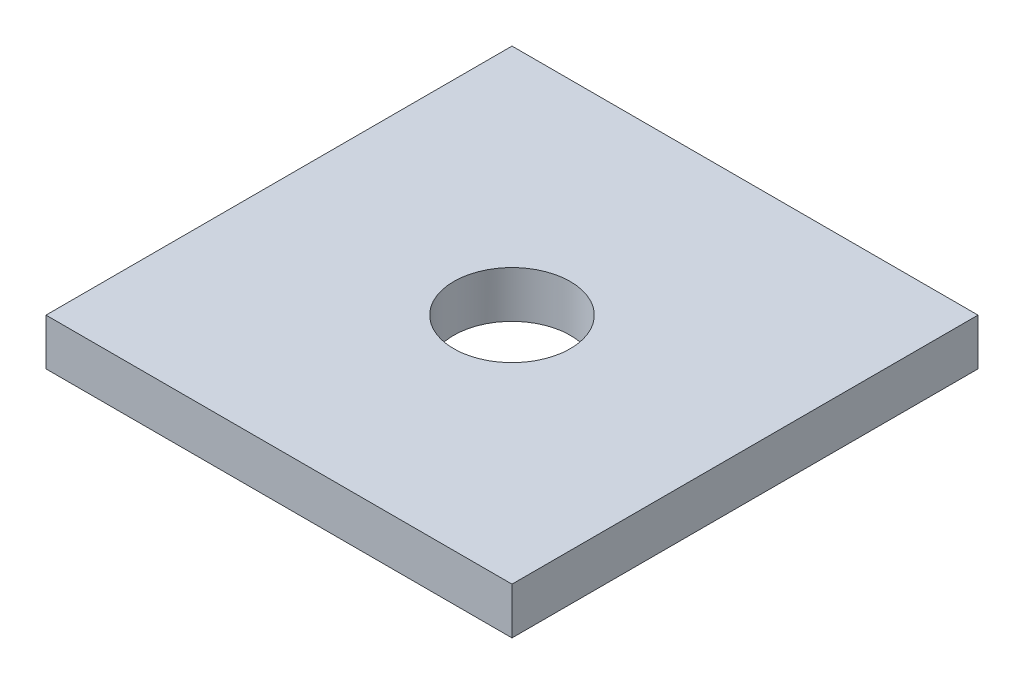
ISO-10303-21;
HEADER;
FILE_DESCRIPTION(('STEP AP214'),'2;1');
FILE_NAME('part.step','',(''),(''),'','','');
FILE_SCHEMA(('AUTOMOTIVE_DESIGN { 1 0 10303 214 1 1 1 1 }'));
ENDSEC;
DATA;
#1=APPLICATION_CONTEXT('core data for automotive mechanical design processes');
#2=APPLICATION_PROTOCOL_DEFINITION('international standard','automotive_design',2000,#1);
#3=PRODUCT_CONTEXT('',#1,'mechanical');
#4=PRODUCT('Part','Part','',(#3));
#5=PRODUCT_RELATED_PRODUCT_CATEGORY('part','',(#4));
#6=PRODUCT_DEFINITION_FORMATION('','',#4);
#7=PRODUCT_DEFINITION_CONTEXT('part definition',#1,'design');
#8=PRODUCT_DEFINITION('design','',#6,#7);
#9=PRODUCT_DEFINITION_SHAPE('','',#8);
#10=(LENGTH_UNIT() NAMED_UNIT(*) SI_UNIT(.MILLI.,.METRE.));
#11=(NAMED_UNIT(*) PLANE_ANGLE_UNIT() SI_UNIT($,.RADIAN.));
#12=(NAMED_UNIT(*) SI_UNIT($,.STERADIAN.) SOLID_ANGLE_UNIT());
#13=UNCERTAINTY_MEASURE_WITH_UNIT(LENGTH_MEASURE(1.E-05),#10,'distance_accuracy_value','');
#14=(GEOMETRIC_REPRESENTATION_CONTEXT(3) GLOBAL_UNCERTAINTY_ASSIGNED_CONTEXT((#13)) GLOBAL_UNIT_ASSIGNED_CONTEXT((#10,
#11,#12)) REPRESENTATION_CONTEXT('',''));
#15=CARTESIAN_POINT('',(0.,0.,0.));
#16=DIRECTION('',(0.,0.,1.));
#17=DIRECTION('',(1.,0.,0.));
#18=AXIS2_PLACEMENT_3D('',#15,#16,#17);
#19=CARTESIAN_POINT('',(20.,4.,-20.));
#20=DIRECTION('',(-1.,0.,0.));
#21=DIRECTION('',(0.,0.,1.));
#22=AXIS2_PLACEMENT_3D('',#19,#20,#21);
#23=PLANE('',#22);
#24=DIRECTION('',(0.,0.,-1.));
#25=VECTOR('',#24,1.);
#26=CARTESIAN_POINT('',(20.,0.,-20.));
#27=LINE('',#26,#25);
#28=CARTESIAN_POINT('',(20.,0.,20.));
#29=VERTEX_POINT('',#28);
#30=CARTESIAN_POINT('',(20.,0.,-20.));
#31=VERTEX_POINT('',#30);
#32=EDGE_CURVE('E100',#29,#31,#27,.T.);
#33=ORIENTED_EDGE('',*,*,#32,.T.);
#34=DIRECTION('',(0.,-1.,0.));
#35=VECTOR('',#34,1.);
#36=CARTESIAN_POINT('',(20.,4.,-20.));
#37=LINE('',#36,#35);
#38=CARTESIAN_POINT('',(20.,4.,-20.));
#39=VERTEX_POINT('',#38);
#40=EDGE_CURVE('E11',#39,#31,#37,.T.);
#41=ORIENTED_EDGE('',*,*,#40,.F.);
#42=DIRECTION('',(0.,0.,-1.));
#43=VECTOR('',#42,1.);
#44=CARTESIAN_POINT('',(20.,4.,-20.));
#45=LINE('',#44,#43);
#46=CARTESIAN_POINT('',(20.,4.,20.));
#47=VERTEX_POINT('',#46);
#48=EDGE_CURVE('E88',#47,#39,#45,.T.);
#49=ORIENTED_EDGE('',*,*,#48,.F.);
#50=DIRECTION('',(0.,-1.,0.));
#51=VECTOR('',#50,1.);
#52=CARTESIAN_POINT('',(20.,4.,20.));
#53=LINE('',#52,#51);
#54=EDGE_CURVE('E96',#47,#29,#53,.T.);
#55=ORIENTED_EDGE('',*,*,#54,.T.);
#56=EDGE_LOOP('',(#33,#41,#49,#55));
#57=FACE_BOUND('',#56,.T.);
#58=ADVANCED_FACE('F37',(#57),#23,.F.);
#59=CARTESIAN_POINT('',(-20.,4.,-20.));
#60=DIRECTION('',(0.,0.,1.));
#61=DIRECTION('',(1.,0.,0.));
#62=AXIS2_PLACEMENT_3D('',#59,#60,#61);
#63=PLANE('',#62);
#64=DIRECTION('',(-1.,0.,0.));
#65=VECTOR('',#64,1.);
#66=CARTESIAN_POINT('',(-20.,0.,-20.));
#67=LINE('',#66,#65);
#68=CARTESIAN_POINT('',(-20.,0.,-20.));
#69=VERTEX_POINT('',#68);
#70=EDGE_CURVE('E92',#31,#69,#67,.T.);
#71=ORIENTED_EDGE('',*,*,#70,.T.);
#72=DIRECTION('',(0.,-1.,0.));
#73=VECTOR('',#72,1.);
#74=CARTESIAN_POINT('',(-20.,4.,-20.));
#75=LINE('',#74,#73);
#76=CARTESIAN_POINT('',(-20.,4.,-20.));
#77=VERTEX_POINT('',#76);
#78=EDGE_CURVE('E45',#77,#69,#75,.T.);
#79=ORIENTED_EDGE('',*,*,#78,.F.);
#80=DIRECTION('',(-1.,0.,0.));
#81=VECTOR('',#80,1.);
#82=CARTESIAN_POINT('',(-20.,4.,-20.));
#83=LINE('',#82,#81);
#84=EDGE_CURVE('E83',#39,#77,#83,.T.);
#85=ORIENTED_EDGE('',*,*,#84,.F.);
#86=ORIENTED_EDGE('',*,*,#40,.T.);
#87=EDGE_LOOP('',(#71,#79,#85,#86));
#88=FACE_BOUND('',#87,.T.);
#89=ADVANCED_FACE('F91',(#88),#63,.F.);
#90=CARTESIAN_POINT('',(-20.,4.,-20.));
#91=DIRECTION('',(1.,0.,0.));
#92=DIRECTION('',(0.,0.,-1.));
#93=AXIS2_PLACEMENT_3D('',#90,#91,#92);
#94=PLANE('',#93);
#95=DIRECTION('',(0.,0.,1.));
#96=VECTOR('',#95,1.);
#97=CARTESIAN_POINT('',(-20.,0.,-20.));
#98=LINE('',#97,#96);
#99=CARTESIAN_POINT('',(-20.,0.,20.));
#100=VERTEX_POINT('',#99);
#101=EDGE_CURVE('E70',#69,#100,#98,.T.);
#102=ORIENTED_EDGE('',*,*,#101,.T.);
#103=DIRECTION('',(0.,-1.,0.));
#104=VECTOR('',#103,1.);
#105=CARTESIAN_POINT('',(-20.,4.,20.));
#106=LINE('',#105,#104);
#107=CARTESIAN_POINT('',(-20.,4.,20.));
#108=VERTEX_POINT('',#107);
#109=EDGE_CURVE('E93',#108,#100,#106,.T.);
#110=ORIENTED_EDGE('',*,*,#109,.F.);
#111=DIRECTION('',(0.,0.,1.));
#112=VECTOR('',#111,1.);
#113=CARTESIAN_POINT('',(-20.,4.,-20.));
#114=LINE('',#113,#112);
#115=EDGE_CURVE('E86',#77,#108,#114,.T.);
#116=ORIENTED_EDGE('',*,*,#115,.F.);
#117=ORIENTED_EDGE('',*,*,#78,.T.);
#118=EDGE_LOOP('',(#102,#110,#116,#117));
#119=FACE_BOUND('',#118,.T.);
#120=ADVANCED_FACE('F94',(#119),#94,.F.);
#121=CARTESIAN_POINT('',(-20.,4.,20.));
#122=DIRECTION('',(0.,0.,-1.));
#123=DIRECTION('',(-1.,0.,0.));
#124=AXIS2_PLACEMENT_3D('',#121,#122,#123);
#125=PLANE('',#124);
#126=DIRECTION('',(1.,0.,0.));
#127=VECTOR('',#126,1.);
#128=CARTESIAN_POINT('',(-20.,0.,20.));
#129=LINE('',#128,#127);
#130=EDGE_CURVE('E76',#100,#29,#129,.T.);
#131=ORIENTED_EDGE('',*,*,#130,.T.);
#132=ORIENTED_EDGE('',*,*,#54,.F.);
#133=DIRECTION('',(1.,0.,0.));
#134=VECTOR('',#133,1.);
#135=CARTESIAN_POINT('',(-20.,4.,20.));
#136=LINE('',#135,#134);
#137=EDGE_CURVE('E53',#108,#47,#136,.T.);
#138=ORIENTED_EDGE('',*,*,#137,.F.);
#139=ORIENTED_EDGE('',*,*,#109,.T.);
#140=EDGE_LOOP('',(#131,#132,#138,#139));
#141=FACE_BOUND('',#140,.T.);
#142=ADVANCED_FACE('F108',(#141),#125,.F.);
#143=CARTESIAN_POINT('',(0.,4.,0.));
#144=DIRECTION('',(0.,1.,0.));
#145=DIRECTION('',(0.,0.,1.));
#146=AXIS2_PLACEMENT_3D('',#143,#144,#145);
#147=PLANE('',#146);
#148=CARTESIAN_POINT('',(0.,4.,0.));
#149=DIRECTION('',(0.,1.,0.));
#150=DIRECTION('',(0.,0.,1.));
#151=AXIS2_PLACEMENT_3D('',#148,#149,#150);
#152=CIRCLE('',#151,5.);
#153=CARTESIAN_POINT('',(0.,4.,5.));
#154=VERTEX_POINT('',#153);
#155=EDGE_CURVE('E103',#154,#154,#152,.T.);
#156=ORIENTED_EDGE('',*,*,#155,.F.);
#157=EDGE_LOOP('',(#156));
#158=FACE_BOUND('',#157,.T.);
#159=ORIENTED_EDGE('',*,*,#48,.T.);
#160=ORIENTED_EDGE('',*,*,#84,.T.);
#161=ORIENTED_EDGE('',*,*,#115,.T.);
#162=ORIENTED_EDGE('',*,*,#137,.T.);
#163=EDGE_LOOP('',(#159,#160,#161,#162));
#164=FACE_BOUND('',#163,.T.);
#165=ADVANCED_FACE('F84',(#158,#164),#147,.T.);
#166=CARTESIAN_POINT('',(0.,0.,0.));
#167=DIRECTION('',(0.,1.,0.));
#168=DIRECTION('',(0.,0.,1.));
#169=AXIS2_PLACEMENT_3D('',#166,#167,#168);
#170=PLANE('',#169);
#171=CARTESIAN_POINT('',(0.,0.,0.));
#172=DIRECTION('',(0.,-1.,0.));
#173=DIRECTION('',(0.,0.,-1.));
#174=AXIS2_PLACEMENT_3D('',#171,#172,#173);
#175=CIRCLE('',#174,5.);
#176=CARTESIAN_POINT('',(0.,0.,-5.));
#177=VERTEX_POINT('',#176);
#178=EDGE_CURVE('E116',#177,#177,#175,.T.);
#179=ORIENTED_EDGE('',*,*,#178,.F.);
#180=EDGE_LOOP('',(#179));
#181=FACE_BOUND('',#180,.T.);
#182=ORIENTED_EDGE('',*,*,#32,.F.);
#183=ORIENTED_EDGE('',*,*,#130,.F.);
#184=ORIENTED_EDGE('',*,*,#101,.F.);
#185=ORIENTED_EDGE('',*,*,#70,.F.);
#186=EDGE_LOOP('',(#182,#183,#184,#185));
#187=FACE_BOUND('',#186,.T.);
#188=ADVANCED_FACE('F111',(#181,#187),#170,.F.);
#189=CARTESIAN_POINT('',(0.,10.,0.));
#190=DIRECTION('',(0.,-1.,0.));
#191=DIRECTION('',(0.,0.,-1.));
#192=AXIS2_PLACEMENT_3D('',#189,#190,#191);
#193=CYLINDRICAL_SURFACE('',#192,5.);
#194=ORIENTED_EDGE('',*,*,#155,.T.);
#195=EDGE_LOOP('',(#194));
#196=FACE_BOUND('',#195,.T.);
#197=ORIENTED_EDGE('',*,*,#178,.T.);
#198=EDGE_LOOP('',(#197));
#199=FACE_BOUND('',#198,.T.);
#200=ADVANCED_FACE('F120',(#196,#199),#193,.F.);
#201=CLOSED_SHELL('',(#58,#89,#120,#142,#165,#188,#200));
#202=MANIFOLD_SOLID_BREP('B2',#201);
#203=ADVANCED_BREP_SHAPE_REPRESENTATION('',(#18,#202),#14);
#204=SHAPE_DEFINITION_REPRESENTATION(#9,#203);
ENDSEC;
END-ISO-10303-21;
